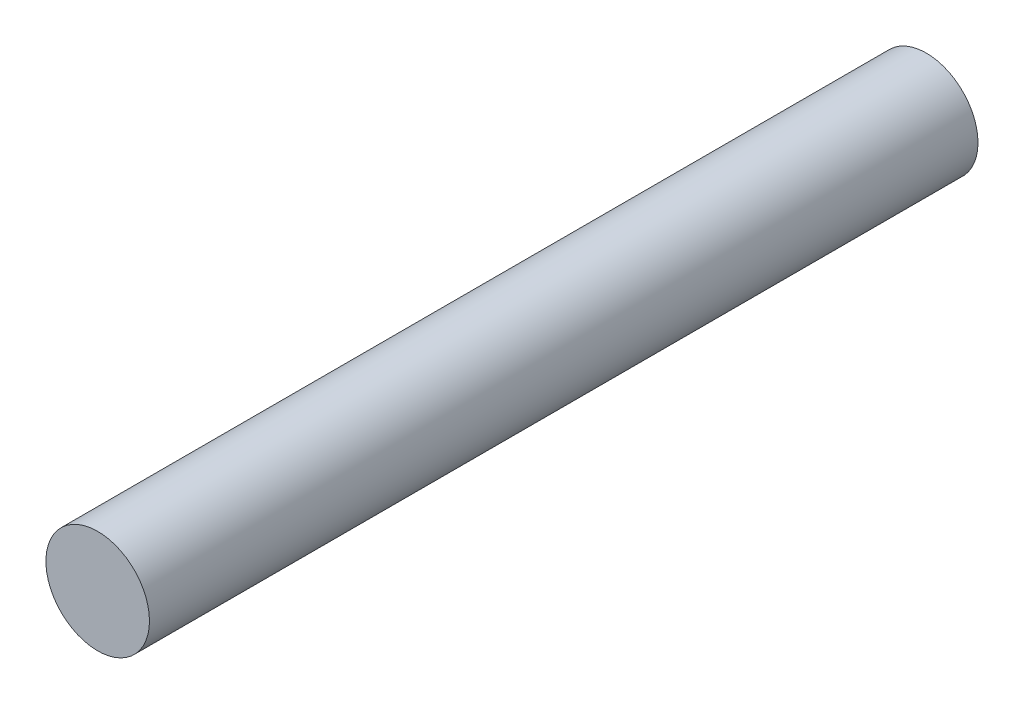
ISO-10303-21;
HEADER;
FILE_DESCRIPTION(('STEP AP214'),'2;1');
FILE_NAME('part.step','',(''),(''),'','','');
FILE_SCHEMA(('AUTOMOTIVE_DESIGN { 1 0 10303 214 1 1 1 1 }'));
ENDSEC;
DATA;
#1=APPLICATION_CONTEXT('core data for automotive mechanical design processes');
#2=APPLICATION_PROTOCOL_DEFINITION('international standard','automotive_design',2000,#1);
#3=PRODUCT_CONTEXT('',#1,'mechanical');
#4=PRODUCT('Part','Part','',(#3));
#5=PRODUCT_RELATED_PRODUCT_CATEGORY('part','',(#4));
#6=PRODUCT_DEFINITION_FORMATION('','',#4);
#7=PRODUCT_DEFINITION_CONTEXT('part definition',#1,'design');
#8=PRODUCT_DEFINITION('design','',#6,#7);
#9=PRODUCT_DEFINITION_SHAPE('','',#8);
#10=(LENGTH_UNIT() NAMED_UNIT(*) SI_UNIT(.MILLI.,.METRE.));
#11=(NAMED_UNIT(*) PLANE_ANGLE_UNIT() SI_UNIT($,.RADIAN.));
#12=(NAMED_UNIT(*) SI_UNIT($,.STERADIAN.) SOLID_ANGLE_UNIT());
#13=UNCERTAINTY_MEASURE_WITH_UNIT(LENGTH_MEASURE(1.E-05),#10,'distance_accuracy_value','');
#14=(GEOMETRIC_REPRESENTATION_CONTEXT(3) GLOBAL_UNCERTAINTY_ASSIGNED_CONTEXT((#13)) GLOBAL_UNIT_ASSIGNED_CONTEXT((#10,
#11,#12)) REPRESENTATION_CONTEXT('',''));
#15=CARTESIAN_POINT('',(0.,0.,0.));
#16=DIRECTION('',(0.,0.,1.));
#17=DIRECTION('',(1.,0.,0.));
#18=AXIS2_PLACEMENT_3D('',#15,#16,#17);
#19=CARTESIAN_POINT('',(0.,0.,120.));
#20=DIRECTION('',(0.,0.,-1.));
#21=DIRECTION('',(-1.,0.,0.));
#22=AXIS2_PLACEMENT_3D('',#19,#20,#21);
#23=CYLINDRICAL_SURFACE('',#22,7.5);
#24=CARTESIAN_POINT('',(0.,0.,120.));
#25=DIRECTION('',(0.,0.,1.));
#26=DIRECTION('',(1.,0.,0.));
#27=AXIS2_PLACEMENT_3D('',#24,#25,#26);
#28=CIRCLE('',#27,7.5);
#29=CARTESIAN_POINT('',(7.5,0.,120.));
#30=VERTEX_POINT('',#29);
#31=EDGE_CURVE('E10',#30,#30,#28,.T.);
#32=ORIENTED_EDGE('',*,*,#31,.F.);
#33=EDGE_LOOP('',(#32));
#34=FACE_BOUND('',#33,.T.);
#35=CARTESIAN_POINT('',(0.,0.,0.));
#36=DIRECTION('',(0.,0.,1.));
#37=DIRECTION('',(1.,0.,0.));
#38=AXIS2_PLACEMENT_3D('',#35,#36,#37);
#39=CIRCLE('',#38,7.5);
#40=CARTESIAN_POINT('',(7.5,0.,0.));
#41=VERTEX_POINT('',#40);
#42=EDGE_CURVE('E42',#41,#41,#39,.T.);
#43=ORIENTED_EDGE('',*,*,#42,.T.);
#44=EDGE_LOOP('',(#43));
#45=FACE_BOUND('',#44,.T.);
#46=ADVANCED_FACE('F39',(#34,#45),#23,.T.);
#47=CARTESIAN_POINT('',(0.,0.,120.));
#48=DIRECTION('',(0.,0.,1.));
#49=DIRECTION('',(1.,0.,0.));
#50=AXIS2_PLACEMENT_3D('',#47,#48,#49);
#51=PLANE('',#50);
#52=ORIENTED_EDGE('',*,*,#31,.T.);
#53=EDGE_LOOP('',(#52));
#54=FACE_BOUND('',#53,.T.);
#55=ADVANCED_FACE('F54',(#54),#51,.T.);
#56=CARTESIAN_POINT('',(0.,0.,0.));
#57=DIRECTION('',(0.,0.,1.));
#58=DIRECTION('',(1.,0.,0.));
#59=AXIS2_PLACEMENT_3D('',#56,#57,#58);
#60=PLANE('',#59);
#61=ORIENTED_EDGE('',*,*,#42,.F.);
#62=EDGE_LOOP('',(#61));
#63=FACE_BOUND('',#62,.T.);
#64=ADVANCED_FACE('F52',(#63),#60,.F.);
#65=CLOSED_SHELL('',(#46,#55,#64));
#66=MANIFOLD_SOLID_BREP('B2',#65);
#67=ADVANCED_BREP_SHAPE_REPRESENTATION('',(#18,#66),#14);
#68=SHAPE_DEFINITION_REPRESENTATION(#9,#67);
ENDSEC;
END-ISO-10303-21;
